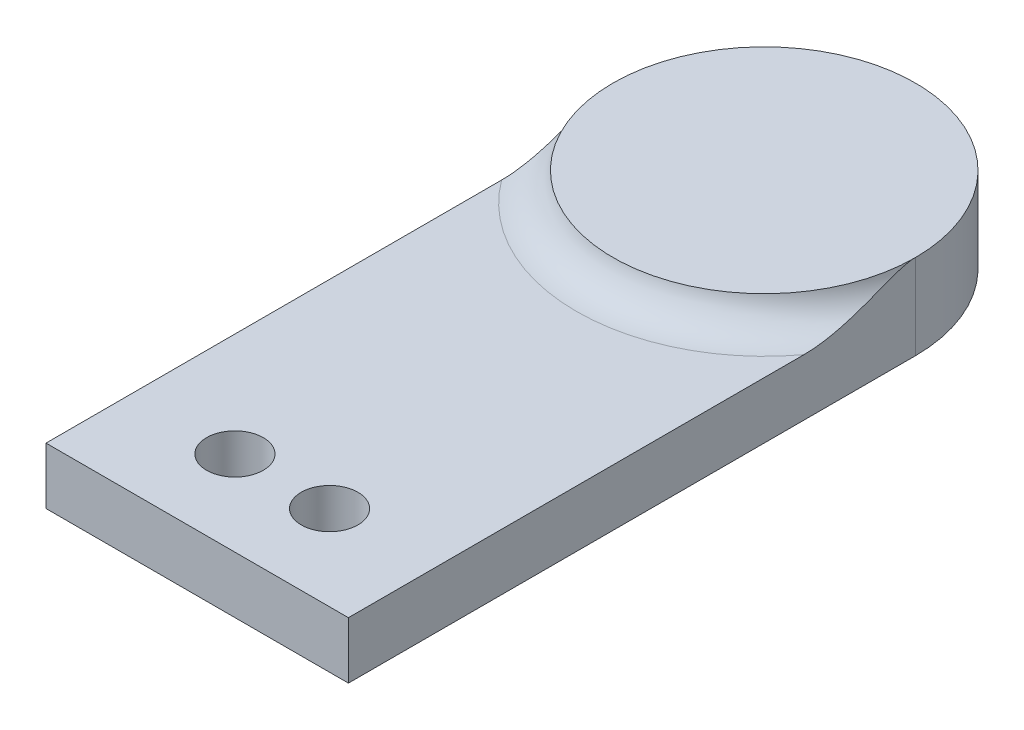
ISO-10303-21;
HEADER;
FILE_DESCRIPTION(('STEP AP214'),'2;1');
FILE_NAME('part.step','',(''),(''),'','','');
FILE_SCHEMA(('AUTOMOTIVE_DESIGN { 1 0 10303 214 1 1 1 1 }'));
ENDSEC;
DATA;
#1=APPLICATION_CONTEXT('core data for automotive mechanical design processes');
#2=APPLICATION_PROTOCOL_DEFINITION('international standard','automotive_design',2000,#1);
#3=PRODUCT_CONTEXT('',#1,'mechanical');
#4=PRODUCT('Part','Part','',(#3));
#5=PRODUCT_RELATED_PRODUCT_CATEGORY('part','',(#4));
#6=PRODUCT_DEFINITION_FORMATION('','',#4);
#7=PRODUCT_DEFINITION_CONTEXT('part definition',#1,'design');
#8=PRODUCT_DEFINITION('design','',#6,#7);
#9=PRODUCT_DEFINITION_SHAPE('','',#8);
#10=(LENGTH_UNIT() NAMED_UNIT(*) SI_UNIT(.MILLI.,.METRE.));
#11=(NAMED_UNIT(*) PLANE_ANGLE_UNIT() SI_UNIT($,.RADIAN.));
#12=(NAMED_UNIT(*) SI_UNIT($,.STERADIAN.) SOLID_ANGLE_UNIT());
#13=UNCERTAINTY_MEASURE_WITH_UNIT(LENGTH_MEASURE(1.E-05),#10,'distance_accuracy_value','');
#14=(GEOMETRIC_REPRESENTATION_CONTEXT(3) GLOBAL_UNCERTAINTY_ASSIGNED_CONTEXT((#13)) GLOBAL_UNIT_ASSIGNED_CONTEXT((#10,
#11,#12)) REPRESENTATION_CONTEXT('',''));
#15=CARTESIAN_POINT('',(0.,0.,0.));
#16=DIRECTION('',(0.,0.,1.));
#17=DIRECTION('',(1.,0.,0.));
#18=AXIS2_PLACEMENT_3D('',#15,#16,#17);
#19=CARTESIAN_POINT('',(0.,3.,0.));
#20=DIRECTION('',(0.,-1.,0.));
#21=DIRECTION('',(0.,0.,-1.));
#22=AXIS2_PLACEMENT_3D('',#19,#20,#21);
#23=CYLINDRICAL_SURFACE('',#22,8.);
#24=CARTESIAN_POINT('',(0.,3.,0.));
#25=DIRECTION('',(0.,1.,0.));
#26=DIRECTION('',(0.,0.,1.));
#27=AXIS2_PLACEMENT_3D('',#24,#25,#26);
#28=CIRCLE('',#27,8.);
#29=CARTESIAN_POINT('',(8.,3.,0.));
#30=VERTEX_POINT('',#29);
#31=CARTESIAN_POINT('',(-8.,3.,0.));
#32=VERTEX_POINT('',#31);
#33=EDGE_CURVE('E117',#30,#32,#28,.T.);
#34=ORIENTED_EDGE('',*,*,#33,.F.);
#35=DIRECTION('',(0.,-1.,0.));
#36=VECTOR('',#35,1.);
#37=CARTESIAN_POINT('',(8.,1.5,0.));
#38=LINE('',#37,#36);
#39=CARTESIAN_POINT('',(8.,-1.5,0.));
#40=VERTEX_POINT('',#39);
#41=EDGE_CURVE('E113',#30,#40,#38,.T.);
#42=ORIENTED_EDGE('',*,*,#41,.T.);
#43=CARTESIAN_POINT('',(0.,-1.5,0.));
#44=DIRECTION('',(0.,1.,0.));
#45=DIRECTION('',(0.,0.,1.));
#46=AXIS2_PLACEMENT_3D('',#43,#44,#45);
#47=CIRCLE('',#46,8.);
#48=CARTESIAN_POINT('',(-8.,-1.5,0.));
#49=VERTEX_POINT('',#48);
#50=EDGE_CURVE('E109',#40,#49,#47,.T.);
#51=ORIENTED_EDGE('',*,*,#50,.T.);
#52=DIRECTION('',(0.,-1.,0.));
#53=VECTOR('',#52,1.);
#54=CARTESIAN_POINT('',(-8.,1.5,0.));
#55=LINE('',#54,#53);
#56=EDGE_CURVE('E154',#32,#49,#55,.T.);
#57=ORIENTED_EDGE('',*,*,#56,.F.);
#58=EDGE_LOOP('',(#34,#42,#51,#57));
#59=FACE_BOUND('',#58,.T.);
#60=ADVANCED_FACE('F36',(#59),#23,.T.);
#61=CARTESIAN_POINT('',(0.,3.,0.));
#62=DIRECTION('',(0.,1.,0.));
#63=DIRECTION('',(0.,0.,1.));
#64=AXIS2_PLACEMENT_3D('',#61,#62,#63);
#65=PLANE('',#64);
#66=ORIENTED_EDGE('',*,*,#33,.T.);
#67=EDGE_CURVE('E111',#32,#30,#28,.T.);
#68=ORIENTED_EDGE('',*,*,#67,.T.);
#69=EDGE_LOOP('',(#66,#68));
#70=FACE_BOUND('',#69,.T.);
#71=ADVANCED_FACE('F142',(#70),#65,.T.);
#72=CARTESIAN_POINT('',(0.,-1.5,0.));
#73=DIRECTION('',(0.,1.,0.));
#74=DIRECTION('',(0.,0.,1.));
#75=AXIS2_PLACEMENT_3D('',#72,#73,#74);
#76=PLANE('',#75);
#77=CARTESIAN_POINT('',(0.,-1.5,0.));
#78=DIRECTION('',(0.,1.,0.));
#79=DIRECTION('',(0.,0.,1.));
#80=AXIS2_PLACEMENT_3D('',#77,#78,#79);
#81=CIRCLE('',#80,3.3);
#82=CARTESIAN_POINT('',(0.,-1.5,3.3));
#83=VERTEX_POINT('',#82);
#84=EDGE_CURVE('E120',#83,#83,#81,.T.);
#85=ORIENTED_EDGE('',*,*,#84,.T.);
#86=EDGE_LOOP('',(#85));
#87=FACE_BOUND('',#86,.T.);
#88=CARTESIAN_POINT('',(-2.50307341777023,-1.5,25.5));
#89=DIRECTION('',(0.,-1.,0.));
#90=DIRECTION('',(0.,0.,-1.));
#91=AXIS2_PLACEMENT_3D('',#88,#89,#90);
#92=CIRCLE('',#91,1.5);
#93=CARTESIAN_POINT('',(-2.50307341777023,-1.5,24.));
#94=VERTEX_POINT('',#93);
#95=EDGE_CURVE('E162',#94,#94,#92,.T.);
#96=ORIENTED_EDGE('',*,*,#95,.F.);
#97=EDGE_LOOP('',(#96));
#98=FACE_BOUND('',#97,.T.);
#99=CARTESIAN_POINT('',(2.50307341777,-1.5,25.5));
#100=DIRECTION('',(0.,-1.,0.));
#101=DIRECTION('',(0.,0.,-1.));
#102=AXIS2_PLACEMENT_3D('',#99,#100,#101);
#103=CIRCLE('',#102,1.5);
#104=CARTESIAN_POINT('',(2.50307341777,-1.5,24.));
#105=VERTEX_POINT('',#104);
#106=EDGE_CURVE('E123',#105,#105,#103,.T.);
#107=ORIENTED_EDGE('',*,*,#106,.F.);
#108=EDGE_LOOP('',(#107));
#109=FACE_BOUND('',#108,.T.);
#110=ORIENTED_EDGE('',*,*,#50,.F.);
#111=DIRECTION('',(0.,0.,-1.));
#112=VECTOR('',#111,1.);
#113=CARTESIAN_POINT('',(8.,-1.5,0.));
#114=LINE('',#113,#112);
#115=CARTESIAN_POINT('',(8.,-1.5,30.));
#116=VERTEX_POINT('',#115);
#117=EDGE_CURVE('E94',#116,#40,#114,.T.);
#118=ORIENTED_EDGE('',*,*,#117,.F.);
#119=DIRECTION('',(1.,0.,0.));
#120=VECTOR('',#119,1.);
#121=CARTESIAN_POINT('',(-8.,-1.5,30.));
#122=LINE('',#121,#120);
#123=CARTESIAN_POINT('',(-8.,-1.5,30.));
#124=VERTEX_POINT('',#123);
#125=EDGE_CURVE('E161',#124,#116,#122,.T.);
#126=ORIENTED_EDGE('',*,*,#125,.F.);
#127=DIRECTION('',(0.,0.,1.));
#128=VECTOR('',#127,1.);
#129=CARTESIAN_POINT('',(-8.,-1.5,0.));
#130=LINE('',#129,#128);
#131=EDGE_CURVE('E108',#49,#124,#130,.T.);
#132=ORIENTED_EDGE('',*,*,#131,.F.);
#133=EDGE_LOOP('',(#110,#118,#126,#132));
#134=FACE_BOUND('',#133,.T.);
#135=ADVANCED_FACE('F139',(#87,#98,#109,#134),#76,.F.);
#136=CARTESIAN_POINT('',(-8.,1.5,0.));
#137=DIRECTION('',(1.,0.,0.));
#138=DIRECTION('',(0.,0.,-1.));
#139=AXIS2_PLACEMENT_3D('',#136,#137,#138);
#140=PLANE('',#139);
#141=ORIENTED_EDGE('',*,*,#131,.T.);
#142=DIRECTION('',(0.,-1.,0.));
#143=VECTOR('',#142,1.);
#144=CARTESIAN_POINT('',(-8.,1.5,30.));
#145=LINE('',#144,#143);
#146=CARTESIAN_POINT('',(-8.,1.5,30.));
#147=VERTEX_POINT('',#146);
#148=EDGE_CURVE('E99',#147,#124,#145,.T.);
#149=ORIENTED_EDGE('',*,*,#148,.F.);
#150=DIRECTION('',(0.,0.,1.));
#151=VECTOR('',#150,1.);
#152=CARTESIAN_POINT('',(-8.,1.5,0.));
#153=LINE('',#152,#151);
#154=CARTESIAN_POINT('',(-8.,1.5,5.89354449967584));
#155=VERTEX_POINT('',#154);
#156=EDGE_CURVE('E86',#155,#147,#153,.T.);
#157=ORIENTED_EDGE('',*,*,#156,.F.);
#158=CARTESIAN_POINT('',(-8.,1.5,5.89354449967584));
#159=CARTESIAN_POINT('',(-8.,1.50001097640396,5.78367317840458));
#160=CARTESIAN_POINT('',(-8.,1.50318423593355,5.67383777792068));
#161=CARTESIAN_POINT('',(-8.,1.51523997390636,5.45454384902484));
#162=CARTESIAN_POINT('',(-8.,1.5241189122397,5.34508512920772));
#163=CARTESIAN_POINT('',(-8.,1.54694784286728,5.12694546211304));
#164=CARTESIAN_POINT('',(-8.,1.56088698888001,5.0182633544996));
#165=CARTESIAN_POINT('',(-8.,1.59330402345963,4.80156940364586));
#166=CARTESIAN_POINT('',(-8.,1.61178268821832,4.69355767827276));
#167=CARTESIAN_POINT('',(-8.,1.67306654585372,4.37177881867344));
#168=CARTESIAN_POINT('',(-8.,1.7218488156564,4.15913420234485));
#169=CARTESIAN_POINT('',(-8.,1.8043762837203,3.84264970178202));
#170=CARTESIAN_POINT('',(-8.,1.83345489269679,3.73753647849755));
#171=CARTESIAN_POINT('',(-8.,1.89433922388056,3.52809198103347));
#172=CARTESIAN_POINT('',(-8.,1.92614508259356,3.4237607462789));
#173=CARTESIAN_POINT('',(-8.,2.00285404413363,3.18189502708979));
#174=CARTESIAN_POINT('',(-8.,2.0486425670085,3.04464278248429));
#175=CARTESIAN_POINT('',(-8.,2.14339115824731,2.77126873456159));
#176=CARTESIAN_POINT('',(-8.,2.19235076364907,2.63514676948835));
#177=CARTESIAN_POINT('',(-8.,2.29239656999028,2.36385745215907));
#178=CARTESIAN_POINT('',(-8.,2.34348044598427,2.2286892362664));
#179=CARTESIAN_POINT('',(-8.,2.44664288651434,1.95862011518225));
#180=CARTESIAN_POINT('',(-8.,2.49872218303474,1.82371949407533));
#181=CARTESIAN_POINT('',(-8.,2.60257487742413,1.55252645325995));
#182=CARTESIAN_POINT('',(-8.,2.65434230780868,1.41623166145101));
#183=CARTESIAN_POINT('',(-8.,2.72907717896885,1.21089780095261));
#184=CARTESIAN_POINT('',(-8.,2.75347588918735,1.14238530562592));
#185=CARTESIAN_POINT('',(-8.,2.80067990580531,1.00481698595592));
#186=CARTESIAN_POINT('',(-8.,2.82348540109419,0.935761227104992));
#187=CARTESIAN_POINT('',(-8.,2.86678873534856,0.796351691913628));
#188=CARTESIAN_POINT('',(-8.,2.88726812480959,0.725992078954176));
#189=CARTESIAN_POINT('',(-8.,2.92443402214308,0.584345268385081));
#190=CARTESIAN_POINT('',(-8.,2.94112507600278,0.513059292232779));
#191=CARTESIAN_POINT('',(-8.,2.96917092975092,0.36866221803117));
#192=CARTESIAN_POINT('',(-8.,2.98047201519567,0.295540094060591));
#193=CARTESIAN_POINT('',(-8.,2.99598314172899,0.148331324309723));
#194=CARTESIAN_POINT('',(-8.,3.00017001780061,0.0742423162027131));
#195=CARTESIAN_POINT('',(-8.,3.,0.));
#196=B_SPLINE_CURVE_WITH_KNOTS('',3,(#158,#159,#160,#161,#162,#163,#164,#165,#166,#167,#168,
#169,#170,#171,#172,#173,#174,#175,#176,#177,#178,#179,#180,#181,#182,#183,#184,#185,#186,#187,
#188,#189,#190,#191,#192,#193,#194,#195),.UNSPECIFIED.,.F.,.F.,(4,2,2,2,2,2,2,2,2,2,2,2,2,2,2,2,
2,2,4),(0.,0.329516525587474,0.658828798549067,0.987439336396049,1.31610610102831,
1.97002547095383,2.29718760077502,2.62436611545305,3.05837924802393,3.49232915905566,
3.92581602062412,4.35963494573943,4.79699519187753,5.01516502426125,5.2333089466704,
5.4530773576189,5.67258063639736,5.89422792076929,6.11659555123796),.UNSPECIFIED.);
#197=EDGE_CURVE('E11',#155,#32,#196,.T.);
#198=ORIENTED_EDGE('',*,*,#197,.T.);
#199=ORIENTED_EDGE('',*,*,#56,.T.);
#200=EDGE_LOOP('',(#141,#149,#157,#198,#199));
#201=FACE_BOUND('',#200,.T.);
#202=ADVANCED_FACE('F105',(#201),#140,.F.);
#203=CARTESIAN_POINT('',(-8.,1.5,30.));
#204=DIRECTION('',(0.,0.,-1.));
#205=DIRECTION('',(-1.,0.,0.));
#206=AXIS2_PLACEMENT_3D('',#203,#204,#205);
#207=PLANE('',#206);
#208=ORIENTED_EDGE('',*,*,#125,.T.);
#209=DIRECTION('',(0.,-1.,0.));
#210=VECTOR('',#209,1.);
#211=CARTESIAN_POINT('',(8.,1.5,30.));
#212=LINE('',#211,#210);
#213=CARTESIAN_POINT('',(8.,1.5,30.));
#214=VERTEX_POINT('',#213);
#215=EDGE_CURVE('E102',#214,#116,#212,.T.);
#216=ORIENTED_EDGE('',*,*,#215,.F.);
#217=DIRECTION('',(1.,0.,0.));
#218=VECTOR('',#217,1.);
#219=CARTESIAN_POINT('',(-8.,1.5,30.));
#220=LINE('',#219,#218);
#221=EDGE_CURVE('E89',#147,#214,#220,.T.);
#222=ORIENTED_EDGE('',*,*,#221,.F.);
#223=ORIENTED_EDGE('',*,*,#148,.T.);
#224=EDGE_LOOP('',(#208,#216,#222,#223));
#225=FACE_BOUND('',#224,.T.);
#226=ADVANCED_FACE('F98',(#225),#207,.F.);
#227=CARTESIAN_POINT('',(8.,1.5,0.));
#228=DIRECTION('',(-1.,0.,0.));
#229=DIRECTION('',(0.,0.,1.));
#230=AXIS2_PLACEMENT_3D('',#227,#228,#229);
#231=PLANE('',#230);
#232=ORIENTED_EDGE('',*,*,#117,.T.);
#233=ORIENTED_EDGE('',*,*,#41,.F.);
#234=CARTESIAN_POINT('',(8.,3.,0.));
#235=CARTESIAN_POINT('',(8.,3.00002521125533,0.0429292044715512));
#236=CARTESIAN_POINT('',(8.,2.99866086464153,0.0858432119996972));
#237=CARTESIAN_POINT('',(8.,2.99336028613075,0.171468232236998));
#238=CARTESIAN_POINT('',(8.,2.98942679176737,0.214179412328309));
#239=CARTESIAN_POINT('',(8.,2.9741460327391,0.341322133846772));
#240=CARTESIAN_POINT('',(8.,2.95931316775853,0.425335606222166));
#241=CARTESIAN_POINT('',(8.,2.92305599635325,0.591730271155208));
#242=CARTESIAN_POINT('',(8.,2.9016392034006,0.674113210967508));
#243=CARTESIAN_POINT('',(8.,2.85456780459741,0.837809802765226));
#244=CARTESIAN_POINT('',(8.,2.82890471533121,0.91912095511301));
#245=CARTESIAN_POINT('',(8.,2.77425853956985,1.08320570535207));
#246=CARTESIAN_POINT('',(8.,2.74520118365885,1.16595408464368));
#247=CARTESIAN_POINT('',(8.,2.68556174044487,1.33090301108682));
#248=CARTESIAN_POINT('',(8.,2.65497949859969,1.41310350175066));
#249=CARTESIAN_POINT('',(8.,2.56214529971085,1.65935563004327));
#250=CARTESIAN_POINT('',(8.,2.49882638727857,1.82300050001923));
#251=CARTESIAN_POINT('',(8.,2.37308074454625,2.15070248246548));
#252=CARTESIAN_POINT('',(8.,2.31065434478306,2.31475972249395));
#253=CARTESIAN_POINT('',(8.,2.18894635699138,2.64401406135324));
#254=CARTESIAN_POINT('',(8.,2.12966413487218,2.80921092270247));
#255=CARTESIAN_POINT('',(8.,2.01627291187933,3.14053379460294));
#256=CARTESIAN_POINT('',(8.,1.96214124420243,3.30665196953132));
#257=CARTESIAN_POINT('',(8.,1.86033953256613,3.64091163512172));
#258=CARTESIAN_POINT('',(8.,1.81267062441433,3.80905347579717));
#259=CARTESIAN_POINT('',(8.,1.72550867331465,4.14723427572529));
#260=CARTESIAN_POINT('',(8.,1.68600523190177,4.31727052787078));
#261=CARTESIAN_POINT('',(8.,1.61688754362019,4.65931455757265));
#262=CARTESIAN_POINT('',(8.,1.58726862039644,4.83132136290948));
#263=CARTESIAN_POINT('',(8.,1.55354885898809,5.07742396912334));
#264=CARTESIAN_POINT('',(8.,1.54457493586981,5.15086644641063));
#265=CARTESIAN_POINT('',(8.,1.52893584702635,5.29799029455156));
#266=CARTESIAN_POINT('',(8.,1.52227036842826,5.37167163166415));
#267=CARTESIAN_POINT('',(8.,1.51136880018894,5.51998413698684));
#268=CARTESIAN_POINT('',(8.,1.50715860184781,5.59461723558935));
#269=CARTESIAN_POINT('',(8.,1.50147494067449,5.74401224771843));
#270=CARTESIAN_POINT('',(8.,1.50000242604157,5.81877419690228));
#271=CARTESIAN_POINT('',(8.,1.5,5.89354449967584));
#272=B_SPLINE_CURVE_WITH_KNOTS('',3,(#234,#235,#236,#237,#238,#239,#240,#241,#242,#243,#244,
#245,#246,#247,#248,#249,#250,#251,#252,#253,#254,#255,#256,#257,#258,#259,#260,#261,#262,#263,
#264,#265,#266,#267,#268,#269,#270,#271),.UNSPECIFIED.,.F.,.F.,(4,2,2,2,2,2,2,2,2,2,2,2,2,2,2,2,
2,2,4),(0.,0.128740377364389,0.257343799813095,0.512843034057083,0.768051772317397,
1.02377667299384,1.28685805293104,1.54996614971479,2.07636524196709,2.60295448064629,
3.12943711434013,3.6534837710289,4.17762240804276,4.70108940189751,5.22430839182697,
5.44624549007251,5.66815249649388,5.89235910143743,6.11664334608889),.UNSPECIFIED.);
#273=CARTESIAN_POINT('',(8.,1.5,5.89354449967584));
#274=VERTEX_POINT('',#273);
#275=EDGE_CURVE('E50',#30,#274,#272,.T.);
#276=ORIENTED_EDGE('',*,*,#275,.T.);
#277=DIRECTION('',(0.,0.,-1.));
#278=VECTOR('',#277,1.);
#279=CARTESIAN_POINT('',(8.,1.5,0.));
#280=LINE('',#279,#278);
#281=EDGE_CURVE('E103',#214,#274,#280,.T.);
#282=ORIENTED_EDGE('',*,*,#281,.F.);
#283=ORIENTED_EDGE('',*,*,#215,.T.);
#284=EDGE_LOOP('',(#232,#233,#276,#282,#283));
#285=FACE_BOUND('',#284,.T.);
#286=ADVANCED_FACE('F129',(#285),#231,.F.);
#287=CARTESIAN_POINT('',(0.,1.5,0.));
#288=DIRECTION('',(0.,1.,0.));
#289=DIRECTION('',(0.,0.,1.));
#290=AXIS2_PLACEMENT_3D('',#287,#288,#289);
#291=PLANE('',#290);
#292=CARTESIAN_POINT('',(-2.50307341777023,1.5,25.5));
#293=DIRECTION('',(0.,1.,0.));
#294=DIRECTION('',(0.,0.,1.));
#295=AXIS2_PLACEMENT_3D('',#292,#293,#294);
#296=CIRCLE('',#295,1.5);
#297=CARTESIAN_POINT('',(-2.50307341777023,1.5,27.));
#298=VERTEX_POINT('',#297);
#299=EDGE_CURVE('E166',#298,#298,#296,.F.);
#300=ORIENTED_EDGE('',*,*,#299,.T.);
#301=EDGE_LOOP('',(#300));
#302=FACE_BOUND('',#301,.T.);
#303=CARTESIAN_POINT('',(2.50307341777,1.5,25.5));
#304=DIRECTION('',(0.,1.,0.));
#305=DIRECTION('',(0.,0.,1.));
#306=AXIS2_PLACEMENT_3D('',#303,#304,#305);
#307=CIRCLE('',#306,1.5);
#308=CARTESIAN_POINT('',(2.50307341777,1.5,27.));
#309=VERTEX_POINT('',#308);
#310=EDGE_CURVE('E173',#309,#309,#307,.F.);
#311=ORIENTED_EDGE('',*,*,#310,.T.);
#312=EDGE_LOOP('',(#311));
#313=FACE_BOUND('',#312,.T.);
#314=ORIENTED_EDGE('',*,*,#281,.T.);
#315=CARTESIAN_POINT('',(0.,1.5,0.));
#316=DIRECTION('',(0.,1.,0.));
#317=DIRECTION('',(0.,0.,1.));
#318=AXIS2_PLACEMENT_3D('',#315,#316,#317);
#319=CIRCLE('',#318,9.93649167310371);
#320=EDGE_CURVE('E63',#274,#155,#319,.F.);
#321=ORIENTED_EDGE('',*,*,#320,.T.);
#322=ORIENTED_EDGE('',*,*,#156,.T.);
#323=ORIENTED_EDGE('',*,*,#221,.T.);
#324=EDGE_LOOP('',(#314,#321,#322,#323));
#325=FACE_BOUND('',#324,.T.);
#326=ADVANCED_FACE('F88',(#302,#313,#325),#291,.T.);
#327=CARTESIAN_POINT('',(2.50307341777,3.001,25.5));
#328=DIRECTION('',(0.,-1.,0.));
#329=DIRECTION('',(0.,0.,-1.));
#330=AXIS2_PLACEMENT_3D('',#327,#328,#329);
#331=CYLINDRICAL_SURFACE('',#330,1.5);
#332=ORIENTED_EDGE('',*,*,#310,.F.);
#333=EDGE_LOOP('',(#332));
#334=FACE_BOUND('',#333,.T.);
#335=ORIENTED_EDGE('',*,*,#106,.T.);
#336=EDGE_LOOP('',(#335));
#337=FACE_BOUND('',#336,.T.);
#338=ADVANCED_FACE('F185',(#334,#337),#331,.F.);
#339=CARTESIAN_POINT('',(-2.50307341777023,3.001,25.5));
#340=DIRECTION('',(0.,-1.,0.));
#341=DIRECTION('',(0.,0.,-1.));
#342=AXIS2_PLACEMENT_3D('',#339,#340,#341);
#343=CYLINDRICAL_SURFACE('',#342,1.5);
#344=ORIENTED_EDGE('',*,*,#299,.F.);
#345=EDGE_LOOP('',(#344));
#346=FACE_BOUND('',#345,.T.);
#347=ORIENTED_EDGE('',*,*,#95,.T.);
#348=EDGE_LOOP('',(#347));
#349=FACE_BOUND('',#348,.T.);
#350=ADVANCED_FACE('F181',(#346,#349),#343,.F.);
#351=CARTESIAN_POINT('',(0.,-1.5,0.));
#352=DIRECTION('',(1.,0.,0.));
#353=DIRECTION('',(0.,0.,-1.));
#354=AXIS2_PLACEMENT_3D('',#351,#352,#353);
#355=SPHERICAL_SURFACE('',#354,3.3);
#356=CARTESIAN_POINT('',(0.,-1.5,0.));
#357=DIRECTION('',(0.,1.,0.));
#358=DIRECTION('',(0.,0.,1.));
#359=AXIS2_PLACEMENT_3D('',#356,#357,#358);
#360=SPHERICAL_SURFACE('',#359,3.3);
#361=ORIENTED_EDGE('',*,*,#84,.F.);
#362=EDGE_LOOP('',(#361));
#363=FACE_BOUND('',#362,.T.);
#364=ADVANCED_FACE('F184',(#363),#360,.F.);
#365=CARTESIAN_POINT('',(0.,3.5,0.));
#366=DIRECTION('',(0.,1.,0.));
#367=DIRECTION('',(0.,0.,1.));
#368=AXIS2_PLACEMENT_3D('',#365,#366,#367);
#369=TOROIDAL_SURFACE('',#368,9.93649167310371,2.);
#370=ORIENTED_EDGE('',*,*,#197,.F.);
#371=ORIENTED_EDGE('',*,*,#320,.F.);
#372=ORIENTED_EDGE('',*,*,#275,.F.);
#373=ORIENTED_EDGE('',*,*,#67,.F.);
#374=EDGE_LOOP('',(#370,#371,#372,#373));
#375=FACE_BOUND('',#374,.T.);
#376=ADVANCED_FACE('F38',(#375),#369,.F.);
#377=CLOSED_SHELL('',(#60,#71,#135,#202,#226,#286,#326,#338,#350,#364,#376));
#378=MANIFOLD_SOLID_BREP('B2',#377);
#379=ADVANCED_BREP_SHAPE_REPRESENTATION('',(#18,#378),#14);
#380=SHAPE_DEFINITION_REPRESENTATION(#9,#379);
ENDSEC;
END-ISO-10303-21;
